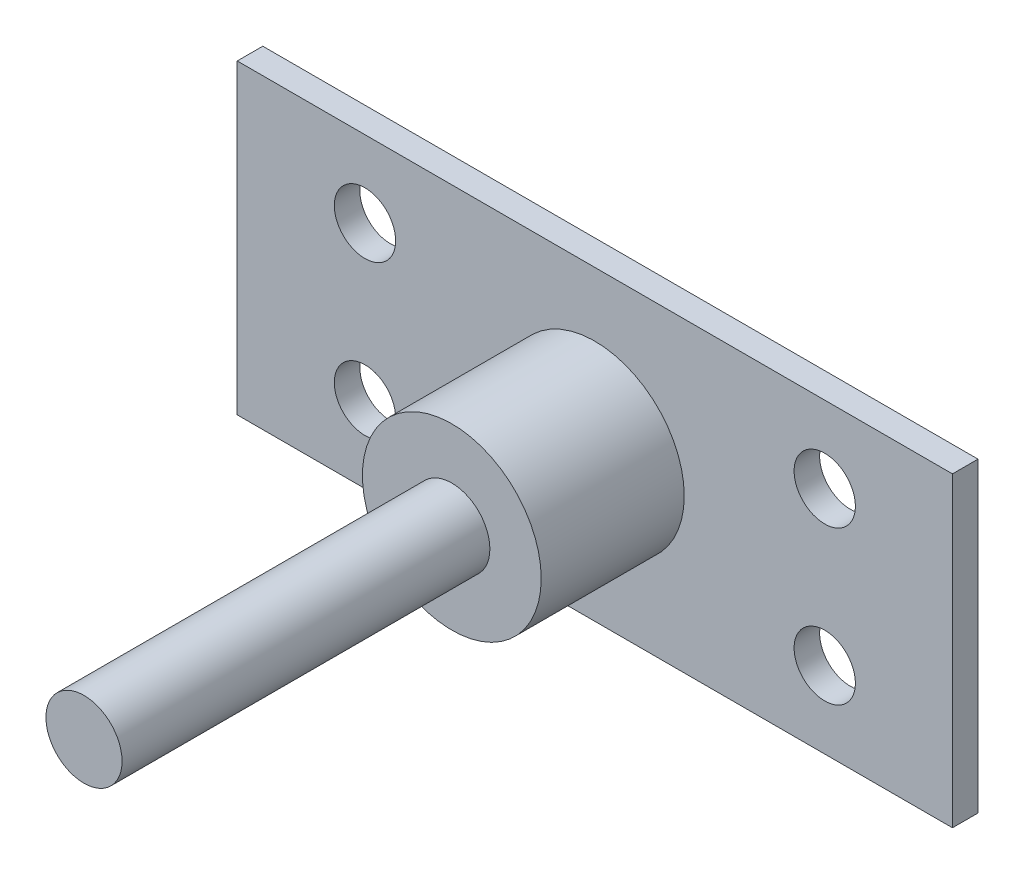
ISO-10303-21;
HEADER;
FILE_DESCRIPTION(('STEP AP214'),'2;1');
FILE_NAME('part.step','',(''),(''),'','','');
FILE_SCHEMA(('AUTOMOTIVE_DESIGN { 1 0 10303 214 1 1 1 1 }'));
ENDSEC;
DATA;
#1=APPLICATION_CONTEXT('core data for automotive mechanical design processes');
#2=APPLICATION_PROTOCOL_DEFINITION('international standard','automotive_design',2000,#1);
#3=PRODUCT_CONTEXT('',#1,'mechanical');
#4=PRODUCT('Part','Part','',(#3));
#5=PRODUCT_RELATED_PRODUCT_CATEGORY('part','',(#4));
#6=PRODUCT_DEFINITION_FORMATION('','',#4);
#7=PRODUCT_DEFINITION_CONTEXT('part definition',#1,'design');
#8=PRODUCT_DEFINITION('design','',#6,#7);
#9=PRODUCT_DEFINITION_SHAPE('','',#8);
#10=(LENGTH_UNIT() NAMED_UNIT(*) SI_UNIT(.MILLI.,.METRE.));
#11=(NAMED_UNIT(*) PLANE_ANGLE_UNIT() SI_UNIT($,.RADIAN.));
#12=(NAMED_UNIT(*) SI_UNIT($,.STERADIAN.) SOLID_ANGLE_UNIT());
#13=UNCERTAINTY_MEASURE_WITH_UNIT(LENGTH_MEASURE(1.E-05),#10,'distance_accuracy_value','');
#14=(GEOMETRIC_REPRESENTATION_CONTEXT(3) GLOBAL_UNCERTAINTY_ASSIGNED_CONTEXT((#13)) GLOBAL_UNIT_ASSIGNED_CONTEXT((#10,
#11,#12)) REPRESENTATION_CONTEXT('',''));
#15=CARTESIAN_POINT('',(0.,0.,0.));
#16=DIRECTION('',(0.,0.,1.));
#17=DIRECTION('',(1.,0.,0.));
#18=AXIS2_PLACEMENT_3D('',#15,#16,#17);
#19=CARTESIAN_POINT('',(70.,30.,5.));
#20=DIRECTION('',(-1.,0.,0.));
#21=DIRECTION('',(0.,0.,1.));
#22=AXIS2_PLACEMENT_3D('',#19,#20,#21);
#23=PLANE('',#22);
#24=DIRECTION('',(0.,1.,0.));
#25=VECTOR('',#24,1.);
#26=CARTESIAN_POINT('',(70.,30.,0.));
#27=LINE('',#26,#25);
#28=CARTESIAN_POINT('',(70.,-30.,0.));
#29=VERTEX_POINT('',#28);
#30=CARTESIAN_POINT('',(70.,30.,0.));
#31=VERTEX_POINT('',#30);
#32=EDGE_CURVE('E105',#29,#31,#27,.T.);
#33=ORIENTED_EDGE('',*,*,#32,.T.);
#34=DIRECTION('',(0.,0.,-1.));
#35=VECTOR('',#34,1.);
#36=CARTESIAN_POINT('',(70.,30.,5.));
#37=LINE('',#36,#35);
#38=CARTESIAN_POINT('',(70.,30.,5.));
#39=VERTEX_POINT('',#38);
#40=EDGE_CURVE('E47',#39,#31,#37,.T.);
#41=ORIENTED_EDGE('',*,*,#40,.F.);
#42=DIRECTION('',(0.,1.,0.));
#43=VECTOR('',#42,1.);
#44=CARTESIAN_POINT('',(70.,30.,5.));
#45=LINE('',#44,#43);
#46=CARTESIAN_POINT('',(70.,-30.,5.));
#47=VERTEX_POINT('',#46);
#48=EDGE_CURVE('E91',#47,#39,#45,.T.);
#49=ORIENTED_EDGE('',*,*,#48,.F.);
#50=DIRECTION('',(0.,0.,-1.));
#51=VECTOR('',#50,1.);
#52=CARTESIAN_POINT('',(70.,-30.,5.));
#53=LINE('',#52,#51);
#54=EDGE_CURVE('E101',#47,#29,#53,.T.);
#55=ORIENTED_EDGE('',*,*,#54,.T.);
#56=EDGE_LOOP('',(#33,#41,#49,#55));
#57=FACE_BOUND('',#56,.T.);
#58=ADVANCED_FACE('F39',(#57),#23,.F.);
#59=CARTESIAN_POINT('',(-70.,30.,5.));
#60=DIRECTION('',(0.,-1.,0.));
#61=DIRECTION('',(0.,0.,-1.));
#62=AXIS2_PLACEMENT_3D('',#59,#60,#61);
#63=PLANE('',#62);
#64=DIRECTION('',(-1.,0.,0.));
#65=VECTOR('',#64,1.);
#66=CARTESIAN_POINT('',(-70.,30.,0.));
#67=LINE('',#66,#65);
#68=CARTESIAN_POINT('',(-70.,30.,0.));
#69=VERTEX_POINT('',#68);
#70=EDGE_CURVE('E96',#31,#69,#67,.T.);
#71=ORIENTED_EDGE('',*,*,#70,.T.);
#72=DIRECTION('',(0.,0.,-1.));
#73=VECTOR('',#72,1.);
#74=CARTESIAN_POINT('',(-70.,30.,5.));
#75=LINE('',#74,#73);
#76=CARTESIAN_POINT('',(-70.,30.,5.));
#77=VERTEX_POINT('',#76);
#78=EDGE_CURVE('E94',#77,#69,#75,.T.);
#79=ORIENTED_EDGE('',*,*,#78,.F.);
#80=DIRECTION('',(-1.,0.,0.));
#81=VECTOR('',#80,1.);
#82=CARTESIAN_POINT('',(-70.,30.,5.));
#83=LINE('',#82,#81);
#84=EDGE_CURVE('E86',#39,#77,#83,.T.);
#85=ORIENTED_EDGE('',*,*,#84,.F.);
#86=ORIENTED_EDGE('',*,*,#40,.T.);
#87=EDGE_LOOP('',(#71,#79,#85,#86));
#88=FACE_BOUND('',#87,.T.);
#89=ADVANCED_FACE('F95',(#88),#63,.F.);
#90=CARTESIAN_POINT('',(-70.,30.,5.));
#91=DIRECTION('',(1.,0.,0.));
#92=DIRECTION('',(0.,1.,0.));
#93=AXIS2_PLACEMENT_3D('',#90,#91,#92);
#94=PLANE('',#93);
#95=DIRECTION('',(0.,-1.,0.));
#96=VECTOR('',#95,1.);
#97=CARTESIAN_POINT('',(-70.,30.,0.));
#98=LINE('',#97,#96);
#99=CARTESIAN_POINT('',(-70.,-30.,0.));
#100=VERTEX_POINT('',#99);
#101=EDGE_CURVE('E72',#69,#100,#98,.T.);
#102=ORIENTED_EDGE('',*,*,#101,.T.);
#103=DIRECTION('',(0.,0.,-1.));
#104=VECTOR('',#103,1.);
#105=CARTESIAN_POINT('',(-70.,-30.,5.));
#106=LINE('',#105,#104);
#107=CARTESIAN_POINT('',(-70.,-30.,5.));
#108=VERTEX_POINT('',#107);
#109=EDGE_CURVE('E97',#108,#100,#106,.T.);
#110=ORIENTED_EDGE('',*,*,#109,.F.);
#111=DIRECTION('',(0.,-1.,0.));
#112=VECTOR('',#111,1.);
#113=CARTESIAN_POINT('',(-70.,30.,5.));
#114=LINE('',#113,#112);
#115=EDGE_CURVE('E89',#77,#108,#114,.T.);
#116=ORIENTED_EDGE('',*,*,#115,.F.);
#117=ORIENTED_EDGE('',*,*,#78,.T.);
#118=EDGE_LOOP('',(#102,#110,#116,#117));
#119=FACE_BOUND('',#118,.T.);
#120=ADVANCED_FACE('F99',(#119),#94,.F.);
#121=CARTESIAN_POINT('',(-70.,-30.,5.));
#122=DIRECTION('',(0.,1.,0.));
#123=DIRECTION('',(0.,0.,1.));
#124=AXIS2_PLACEMENT_3D('',#121,#122,#123);
#125=PLANE('',#124);
#126=DIRECTION('',(1.,0.,0.));
#127=VECTOR('',#126,1.);
#128=CARTESIAN_POINT('',(-70.,-30.,0.));
#129=LINE('',#128,#127);
#130=EDGE_CURVE('E78',#100,#29,#129,.T.);
#131=ORIENTED_EDGE('',*,*,#130,.T.);
#132=ORIENTED_EDGE('',*,*,#54,.F.);
#133=DIRECTION('',(1.,0.,0.));
#134=VECTOR('',#133,1.);
#135=CARTESIAN_POINT('',(-70.,-30.,5.));
#136=LINE('',#135,#134);
#137=EDGE_CURVE('E55',#108,#47,#136,.T.);
#138=ORIENTED_EDGE('',*,*,#137,.F.);
#139=ORIENTED_EDGE('',*,*,#109,.T.);
#140=EDGE_LOOP('',(#131,#132,#138,#139));
#141=FACE_BOUND('',#140,.T.);
#142=ADVANCED_FACE('F130',(#141),#125,.F.);
#143=CARTESIAN_POINT('',(0.,0.,5.));
#144=DIRECTION('',(0.,0.,1.));
#145=DIRECTION('',(1.,0.,0.));
#146=AXIS2_PLACEMENT_3D('',#143,#144,#145);
#147=PLANE('',#146);
#148=CARTESIAN_POINT('',(0.,0.,5.));
#149=DIRECTION('',(0.,0.,1.));
#150=DIRECTION('',(1.,0.,0.));
#151=AXIS2_PLACEMENT_3D('',#148,#149,#150);
#152=CIRCLE('',#151,17.5);
#153=CARTESIAN_POINT('',(17.5,0.,5.));
#154=VERTEX_POINT('',#153);
#155=EDGE_CURVE('E235',#154,#154,#152,.T.);
#156=ORIENTED_EDGE('',*,*,#155,.F.);
#157=EDGE_LOOP('',(#156));
#158=FACE_BOUND('',#157,.T.);
#159=CARTESIAN_POINT('',(45.,15.,5.));
#160=DIRECTION('',(0.,0.,1.));
#161=DIRECTION('',(1.,0.,0.));
#162=AXIS2_PLACEMENT_3D('',#159,#160,#161);
#163=CIRCLE('',#162,6.);
#164=CARTESIAN_POINT('',(51.,15.,5.));
#165=VERTEX_POINT('',#164);
#166=EDGE_CURVE('E256',#165,#165,#163,.T.);
#167=ORIENTED_EDGE('',*,*,#166,.F.);
#168=EDGE_LOOP('',(#167));
#169=FACE_BOUND('',#168,.T.);
#170=CARTESIAN_POINT('',(-45.,15.,5.));
#171=DIRECTION('',(0.,0.,1.));
#172=DIRECTION('',(1.,0.,0.));
#173=AXIS2_PLACEMENT_3D('',#170,#171,#172);
#174=CIRCLE('',#173,6.);
#175=CARTESIAN_POINT('',(-39.,15.,5.));
#176=VERTEX_POINT('',#175);
#177=EDGE_CURVE('E250',#176,#176,#174,.T.);
#178=ORIENTED_EDGE('',*,*,#177,.F.);
#179=EDGE_LOOP('',(#178));
#180=FACE_BOUND('',#179,.T.);
#181=CARTESIAN_POINT('',(45.,-15.,5.));
#182=DIRECTION('',(0.,0.,1.));
#183=DIRECTION('',(1.,0.,0.));
#184=AXIS2_PLACEMENT_3D('',#181,#182,#183);
#185=CIRCLE('',#184,5.99999999999999);
#186=CARTESIAN_POINT('',(51.,-15.,5.));
#187=VERTEX_POINT('',#186);
#188=EDGE_CURVE('E243',#187,#187,#185,.T.);
#189=ORIENTED_EDGE('',*,*,#188,.F.);
#190=EDGE_LOOP('',(#189));
#191=FACE_BOUND('',#190,.T.);
#192=CARTESIAN_POINT('',(-45.,-15.,5.));
#193=DIRECTION('',(0.,0.,1.));
#194=DIRECTION('',(1.,0.,0.));
#195=AXIS2_PLACEMENT_3D('',#192,#193,#194);
#196=CIRCLE('',#195,5.99999999999999);
#197=CARTESIAN_POINT('',(-39.,-15.,5.));
#198=VERTEX_POINT('',#197);
#199=EDGE_CURVE('E246',#198,#198,#196,.T.);
#200=ORIENTED_EDGE('',*,*,#199,.F.);
#201=EDGE_LOOP('',(#200));
#202=FACE_BOUND('',#201,.T.);
#203=ORIENTED_EDGE('',*,*,#48,.T.);
#204=ORIENTED_EDGE('',*,*,#84,.T.);
#205=ORIENTED_EDGE('',*,*,#115,.T.);
#206=ORIENTED_EDGE('',*,*,#137,.T.);
#207=EDGE_LOOP('',(#203,#204,#205,#206));
#208=FACE_BOUND('',#207,.T.);
#209=ADVANCED_FACE('F87',(#158,#169,#180,#191,#202,#208),#147,.T.);
#210=CARTESIAN_POINT('',(0.,0.,0.));
#211=DIRECTION('',(0.,0.,1.));
#212=DIRECTION('',(1.,0.,0.));
#213=AXIS2_PLACEMENT_3D('',#210,#211,#212);
#214=PLANE('',#213);
#215=CARTESIAN_POINT('',(45.,15.,0.));
#216=DIRECTION('',(0.,0.,1.));
#217=DIRECTION('',(1.,0.,0.));
#218=AXIS2_PLACEMENT_3D('',#215,#216,#217);
#219=CIRCLE('',#218,6.);
#220=CARTESIAN_POINT('',(51.,15.,0.));
#221=VERTEX_POINT('',#220);
#222=EDGE_CURVE('E238',#221,#221,#219,.T.);
#223=ORIENTED_EDGE('',*,*,#222,.T.);
#224=EDGE_LOOP('',(#223));
#225=FACE_BOUND('',#224,.T.);
#226=CARTESIAN_POINT('',(-45.,15.,0.));
#227=DIRECTION('',(0.,0.,1.));
#228=DIRECTION('',(1.,0.,0.));
#229=AXIS2_PLACEMENT_3D('',#226,#227,#228);
#230=CIRCLE('',#229,6.);
#231=CARTESIAN_POINT('',(-39.,15.,0.));
#232=VERTEX_POINT('',#231);
#233=EDGE_CURVE('E253',#232,#232,#230,.T.);
#234=ORIENTED_EDGE('',*,*,#233,.T.);
#235=EDGE_LOOP('',(#234));
#236=FACE_BOUND('',#235,.T.);
#237=CARTESIAN_POINT('',(45.,-15.,0.));
#238=DIRECTION('',(0.,0.,1.));
#239=DIRECTION('',(1.,0.,0.));
#240=AXIS2_PLACEMENT_3D('',#237,#238,#239);
#241=CIRCLE('',#240,5.99999999999999);
#242=CARTESIAN_POINT('',(51.,-15.,0.));
#243=VERTEX_POINT('',#242);
#244=EDGE_CURVE('E247',#243,#243,#241,.T.);
#245=ORIENTED_EDGE('',*,*,#244,.T.);
#246=EDGE_LOOP('',(#245));
#247=FACE_BOUND('',#246,.T.);
#248=CARTESIAN_POINT('',(-45.,-15.,0.));
#249=DIRECTION('',(0.,0.,1.));
#250=DIRECTION('',(1.,0.,0.));
#251=AXIS2_PLACEMENT_3D('',#248,#249,#250);
#252=CIRCLE('',#251,5.99999999999999);
#253=CARTESIAN_POINT('',(-39.,-15.,0.));
#254=VERTEX_POINT('',#253);
#255=EDGE_CURVE('E108',#254,#254,#252,.T.);
#256=ORIENTED_EDGE('',*,*,#255,.T.);
#257=EDGE_LOOP('',(#256));
#258=FACE_BOUND('',#257,.T.);
#259=ORIENTED_EDGE('',*,*,#32,.F.);
#260=ORIENTED_EDGE('',*,*,#130,.F.);
#261=ORIENTED_EDGE('',*,*,#101,.F.);
#262=ORIENTED_EDGE('',*,*,#70,.F.);
#263=EDGE_LOOP('',(#259,#260,#261,#262));
#264=FACE_BOUND('',#263,.T.);
#265=ADVANCED_FACE('F116',(#225,#236,#247,#258,#264),#214,.F.);
#266=CARTESIAN_POINT('',(-45.,-15.,0.));
#267=DIRECTION('',(0.,0.,1.));
#268=DIRECTION('',(1.,0.,0.));
#269=AXIS2_PLACEMENT_3D('',#266,#267,#268);
#270=CYLINDRICAL_SURFACE('',#269,5.99999999999999);
#271=ORIENTED_EDGE('',*,*,#255,.F.);
#272=EDGE_LOOP('',(#271));
#273=FACE_BOUND('',#272,.T.);
#274=ORIENTED_EDGE('',*,*,#199,.T.);
#275=EDGE_LOOP('',(#274));
#276=FACE_BOUND('',#275,.T.);
#277=ADVANCED_FACE('F118',(#273,#276),#270,.F.);
#278=CARTESIAN_POINT('',(45.,-15.,0.));
#279=DIRECTION('',(0.,0.,1.));
#280=DIRECTION('',(1.,0.,0.));
#281=AXIS2_PLACEMENT_3D('',#278,#279,#280);
#282=CYLINDRICAL_SURFACE('',#281,5.99999999999999);
#283=ORIENTED_EDGE('',*,*,#244,.F.);
#284=EDGE_LOOP('',(#283));
#285=FACE_BOUND('',#284,.T.);
#286=ORIENTED_EDGE('',*,*,#188,.T.);
#287=EDGE_LOOP('',(#286));
#288=FACE_BOUND('',#287,.T.);
#289=ADVANCED_FACE('F126',(#285,#288),#282,.F.);
#290=CARTESIAN_POINT('',(-45.,15.,0.));
#291=DIRECTION('',(0.,0.,1.));
#292=DIRECTION('',(1.,0.,0.));
#293=AXIS2_PLACEMENT_3D('',#290,#291,#292);
#294=CYLINDRICAL_SURFACE('',#293,6.);
#295=ORIENTED_EDGE('',*,*,#233,.F.);
#296=EDGE_LOOP('',(#295));
#297=FACE_BOUND('',#296,.T.);
#298=ORIENTED_EDGE('',*,*,#177,.T.);
#299=EDGE_LOOP('',(#298));
#300=FACE_BOUND('',#299,.T.);
#301=ADVANCED_FACE('F163',(#297,#300),#294,.F.);
#302=CARTESIAN_POINT('',(45.,15.,0.));
#303=DIRECTION('',(0.,0.,1.));
#304=DIRECTION('',(1.,0.,0.));
#305=AXIS2_PLACEMENT_3D('',#302,#303,#304);
#306=CYLINDRICAL_SURFACE('',#305,6.);
#307=ORIENTED_EDGE('',*,*,#222,.F.);
#308=EDGE_LOOP('',(#307));
#309=FACE_BOUND('',#308,.T.);
#310=ORIENTED_EDGE('',*,*,#166,.T.);
#311=EDGE_LOOP('',(#310));
#312=FACE_BOUND('',#311,.T.);
#313=ADVANCED_FACE('F171',(#309,#312),#306,.F.);
#314=CARTESIAN_POINT('',(0.,0.,33.));
#315=DIRECTION('',(0.,0.,-1.));
#316=DIRECTION('',(-1.,0.,0.));
#317=AXIS2_PLACEMENT_3D('',#314,#315,#316);
#318=CYLINDRICAL_SURFACE('',#317,17.5);
#319=CARTESIAN_POINT('',(0.,0.,33.));
#320=DIRECTION('',(0.,0.,1.));
#321=DIRECTION('',(1.,0.,0.));
#322=AXIS2_PLACEMENT_3D('',#319,#320,#321);
#323=CIRCLE('',#322,17.5);
#324=CARTESIAN_POINT('',(17.5,0.,33.));
#325=VERTEX_POINT('',#324);
#326=EDGE_CURVE('E233',#325,#325,#323,.T.);
#327=ORIENTED_EDGE('',*,*,#326,.F.);
#328=EDGE_LOOP('',(#327));
#329=FACE_BOUND('',#328,.T.);
#330=ORIENTED_EDGE('',*,*,#155,.T.);
#331=EDGE_LOOP('',(#330));
#332=FACE_BOUND('',#331,.T.);
#333=ADVANCED_FACE('F179',(#329,#332),#318,.T.);
#334=CARTESIAN_POINT('',(0.,0.,33.));
#335=DIRECTION('',(0.,0.,1.));
#336=DIRECTION('',(1.,0.,0.));
#337=AXIS2_PLACEMENT_3D('',#334,#335,#336);
#338=PLANE('',#337);
#339=CARTESIAN_POINT('',(0.,0.,33.));
#340=DIRECTION('',(0.,0.,1.));
#341=DIRECTION('',(1.,0.,0.));
#342=AXIS2_PLACEMENT_3D('',#339,#340,#341);
#343=CIRCLE('',#342,7.45);
#344=CARTESIAN_POINT('',(7.45,0.,33.));
#345=VERTEX_POINT('',#344);
#346=EDGE_CURVE('E11',#345,#345,#343,.F.);
#347=ORIENTED_EDGE('',*,*,#346,.T.);
#348=EDGE_LOOP('',(#347));
#349=FACE_BOUND('',#348,.T.);
#350=ORIENTED_EDGE('',*,*,#326,.T.);
#351=EDGE_LOOP('',(#350));
#352=FACE_BOUND('',#351,.T.);
#353=ADVANCED_FACE('F208',(#349,#352),#338,.T.);
#354=CARTESIAN_POINT('',(0.,0.,105.));
#355=DIRECTION('',(0.,0.,1.));
#356=DIRECTION('',(1.,0.,0.));
#357=AXIS2_PLACEMENT_3D('',#354,#355,#356);
#358=PLANE('',#357);
#359=CARTESIAN_POINT('',(0.,0.,105.));
#360=DIRECTION('',(0.,0.,1.));
#361=DIRECTION('',(1.,0.,0.));
#362=AXIS2_PLACEMENT_3D('',#359,#360,#361);
#363=CIRCLE('',#362,7.45);
#364=CARTESIAN_POINT('',(7.45,0.,105.));
#365=VERTEX_POINT('',#364);
#366=EDGE_CURVE('E234',#365,#365,#363,.T.);
#367=ORIENTED_EDGE('',*,*,#366,.T.);
#368=EDGE_LOOP('',(#367));
#369=FACE_BOUND('',#368,.T.);
#370=ADVANCED_FACE('F198',(#369),#358,.T.);
#371=CARTESIAN_POINT('',(0.,0.,0.));
#372=DIRECTION('',(0.,0.,1.));
#373=DIRECTION('',(1.,0.,0.));
#374=AXIS2_PLACEMENT_3D('',#371,#372,#373);
#375=CYLINDRICAL_SURFACE('',#374,7.45);
#376=ORIENTED_EDGE('',*,*,#346,.F.);
#377=EDGE_LOOP('',(#376));
#378=FACE_BOUND('',#377,.T.);
#379=ORIENTED_EDGE('',*,*,#366,.F.);
#380=EDGE_LOOP('',(#379));
#381=FACE_BOUND('',#380,.T.);
#382=ADVANCED_FACE('F193',(#378,#381),#375,.T.);
#383=CLOSED_SHELL('',(#58,#89,#120,#142,#209,#265,#277,#289,#301,#313,#333,#353,#370,#382));
#384=MANIFOLD_SOLID_BREP('B2',#383);
#385=ADVANCED_BREP_SHAPE_REPRESENTATION('',(#18,#384),#14);
#386=SHAPE_DEFINITION_REPRESENTATION(#9,#385);
ENDSEC;
END-ISO-10303-21;
